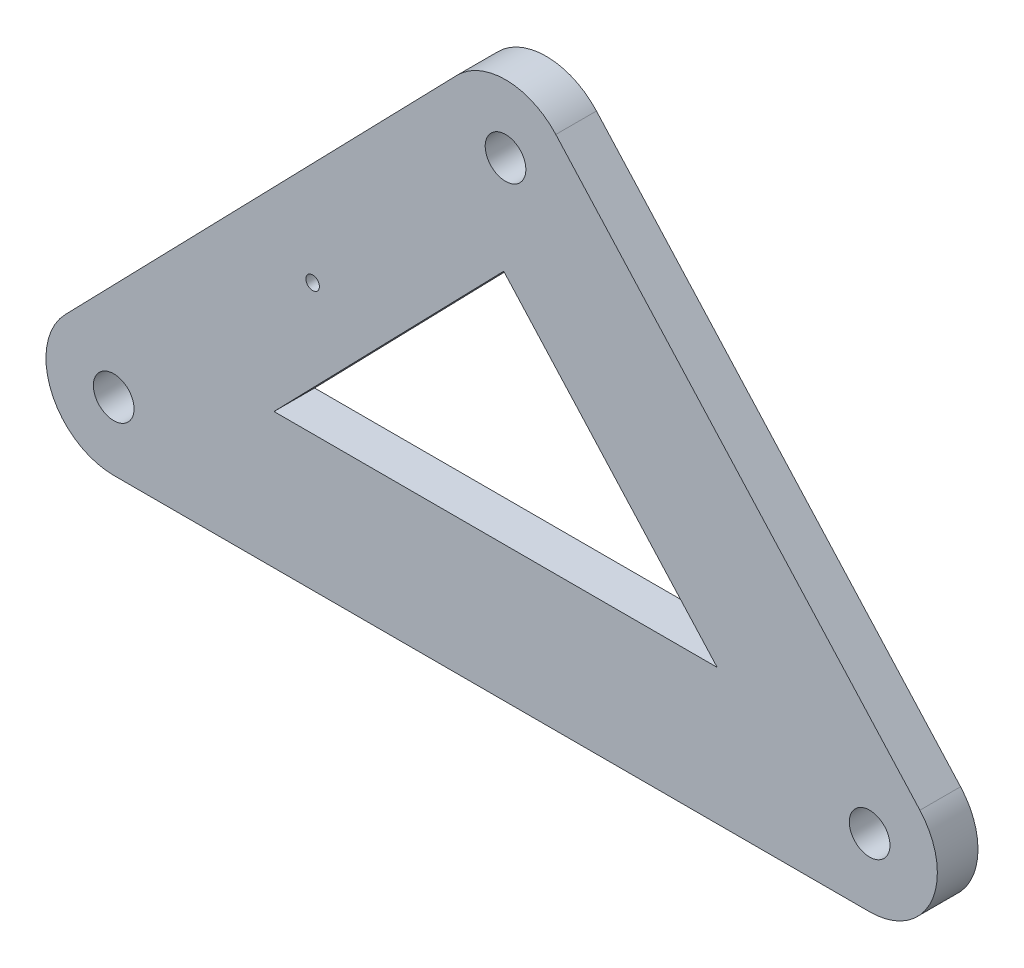
ISO-10303-21;
HEADER;
FILE_DESCRIPTION(('STEP AP214'),'2;1');
FILE_NAME('part.step','',(''),(''),'','','');
FILE_SCHEMA(('AUTOMOTIVE_DESIGN { 1 0 10303 214 1 1 1 1 }'));
ENDSEC;
DATA;
#1=APPLICATION_CONTEXT('core data for automotive mechanical design processes');
#2=APPLICATION_PROTOCOL_DEFINITION('international standard','automotive_design',2000,#1);
#3=PRODUCT_CONTEXT('',#1,'mechanical');
#4=PRODUCT('Part','Part','',(#3));
#5=PRODUCT_RELATED_PRODUCT_CATEGORY('part','',(#4));
#6=PRODUCT_DEFINITION_FORMATION('','',#4);
#7=PRODUCT_DEFINITION_CONTEXT('part definition',#1,'design');
#8=PRODUCT_DEFINITION('design','',#6,#7);
#9=PRODUCT_DEFINITION_SHAPE('','',#8);
#10=(LENGTH_UNIT() NAMED_UNIT(*) SI_UNIT(.MILLI.,.METRE.));
#11=(NAMED_UNIT(*) PLANE_ANGLE_UNIT() SI_UNIT($,.RADIAN.));
#12=(NAMED_UNIT(*) SI_UNIT($,.STERADIAN.) SOLID_ANGLE_UNIT());
#13=UNCERTAINTY_MEASURE_WITH_UNIT(LENGTH_MEASURE(1.E-05),#10,'distance_accuracy_value','');
#14=(GEOMETRIC_REPRESENTATION_CONTEXT(3) GLOBAL_UNCERTAINTY_ASSIGNED_CONTEXT((#13)) GLOBAL_UNIT_ASSIGNED_CONTEXT((#10,
#11,#12)) REPRESENTATION_CONTEXT('',''));
#15=CARTESIAN_POINT('',(0.,0.,0.));
#16=DIRECTION('',(0.,0.,1.));
#17=DIRECTION('',(1.,0.,0.));
#18=AXIS2_PLACEMENT_3D('',#15,#16,#17);
#19=CARTESIAN_POINT('',(28.9236559139785,29.7602440945933,3.));
#20=DIRECTION('',(0.,0.,1.));
#21=DIRECTION('',(1.,0.,0.));
#22=AXIS2_PLACEMENT_3D('',#19,#20,#21);
#23=PLANE('',#22);
#24=CARTESIAN_POINT('',(14.6844041623818,14.6605175350608,3.));
#25=DIRECTION('',(0.,0.,1.));
#26=DIRECTION('',(1.,0.,0.));
#27=AXIS2_PLACEMENT_3D('',#24,#25,#26);
#28=CIRCLE('',#27,0.499999999999999);
#29=CARTESIAN_POINT('',(15.1844041623818,14.6605175350608,3.));
#30=VERTEX_POINT('',#29);
#31=EDGE_CURVE('E252',#30,#30,#28,.T.);
#32=ORIENTED_EDGE('',*,*,#31,.F.);
#33=EDGE_LOOP('',(#32));
#34=FACE_BOUND('',#33,.T.);
#35=CARTESIAN_POINT('',(0.,0.,3.));
#36=DIRECTION('',(0.,0.,1.));
#37=DIRECTION('',(1.,0.,0.));
#38=AXIS2_PLACEMENT_3D('',#35,#36,#37);
#39=CIRCLE('',#38,1.5);
#40=CARTESIAN_POINT('',(1.5,0.,3.));
#41=VERTEX_POINT('',#40);
#42=EDGE_CURVE('E263',#41,#41,#39,.T.);
#43=ORIENTED_EDGE('',*,*,#42,.F.);
#44=EDGE_LOOP('',(#43));
#45=FACE_BOUND('',#44,.T.);
#46=DIRECTION('',(-0.670233019601534,0.742150725550956,0.));
#47=VECTOR('',#46,1.);
#48=CARTESIAN_POINT('',(28.7897592995052,22.4484161376041,3.));
#49=LINE('',#48,#47);
#50=CARTESIAN_POINT('',(44.5473463132331,5.,3.));
#51=VERTEX_POINT('',#50);
#52=CARTESIAN_POINT('',(28.7897592995052,22.4484161376041,3.));
#53=VERTEX_POINT('',#52);
#54=EDGE_CURVE('E116',#51,#53,#49,.T.);
#55=ORIENTED_EDGE('',*,*,#54,.F.);
#56=DIRECTION('',(1.,0.,0.));
#57=VECTOR('',#56,1.);
#58=CARTESIAN_POINT('',(44.5473463132331,5.,3.));
#59=LINE('',#58,#57);
#60=CARTESIAN_POINT('',(11.8318343912328,5.,3.));
#61=VERTEX_POINT('',#60);
#62=EDGE_CURVE('E108',#61,#51,#59,.T.);
#63=ORIENTED_EDGE('',*,*,#62,.F.);
#64=DIRECTION('',(-0.696955564192253,-0.717114315532369,0.));
#65=VECTOR('',#64,1.);
#66=CARTESIAN_POINT('',(11.8318343912328,5.,3.));
#67=LINE('',#66,#65);
#68=EDGE_CURVE('E126',#53,#61,#67,.T.);
#69=ORIENTED_EDGE('',*,*,#68,.F.);
#70=EDGE_LOOP('',(#55,#63,#69));
#71=FACE_BOUND('',#70,.T.);
#72=CARTESIAN_POINT('',(28.9236559139785,29.7602440945933,3.));
#73=DIRECTION('',(0.,0.,1.));
#74=DIRECTION('',(1.,0.,0.));
#75=AXIS2_PLACEMENT_3D('',#72,#73,#74);
#76=CIRCLE('',#75,5.);
#77=CARTESIAN_POINT('',(32.6344095417333,33.111409192601,3.));
#78=VERTEX_POINT('',#77);
#79=CARTESIAN_POINT('',(25.3380843363166,33.2450219155546,3.));
#80=VERTEX_POINT('',#79);
#81=EDGE_CURVE('E138',#78,#80,#76,.T.);
#82=ORIENTED_EDGE('',*,*,#81,.T.);
#83=DIRECTION('',(-0.696955564192253,-0.717114315532369,0.));
#84=VECTOR('',#83,1.);
#85=CARTESIAN_POINT('',(-3.58557157766176,3.48477782096135,3.));
#86=LINE('',#85,#84);
#87=CARTESIAN_POINT('',(-3.58557157766176,3.48477782096135,3.));
#88=VERTEX_POINT('',#87);
#89=EDGE_CURVE('E141',#80,#88,#86,.T.);
#90=ORIENTED_EDGE('',*,*,#89,.T.);
#91=CARTESIAN_POINT('',(0.,0.,3.));
#92=DIRECTION('',(0.,0.,1.));
#93=DIRECTION('',(-1.,0.,0.));
#94=AXIS2_PLACEMENT_3D('',#91,#92,#93);
#95=CIRCLE('',#94,5.);
#96=CARTESIAN_POINT('',(1.196959198424E-13,-5.,3.));
#97=VERTEX_POINT('',#96);
#98=EDGE_CURVE('E144',#88,#97,#95,.T.);
#99=ORIENTED_EDGE('',*,*,#98,.T.);
#100=DIRECTION('',(1.,0.,0.));
#101=VECTOR('',#100,1.);
#102=CARTESIAN_POINT('',(55.7999999999999,-5.,3.));
#103=LINE('',#102,#101);
#104=CARTESIAN_POINT('',(55.7999999999999,-5.,3.));
#105=VERTEX_POINT('',#104);
#106=EDGE_CURVE('E146',#97,#105,#103,.T.);
#107=ORIENTED_EDGE('',*,*,#106,.T.);
#108=CARTESIAN_POINT('',(55.8,0.,3.));
#109=DIRECTION('',(0.,0.,1.));
#110=DIRECTION('',(1.,0.,0.));
#111=AXIS2_PLACEMENT_3D('',#108,#109,#110);
#112=CIRCLE('',#111,5.);
#113=CARTESIAN_POINT('',(59.5107536277547,3.35116509800775,3.));
#114=VERTEX_POINT('',#113);
#115=EDGE_CURVE('E148',#105,#114,#112,.T.);
#116=ORIENTED_EDGE('',*,*,#115,.T.);
#117=DIRECTION('',(-0.670233019601534,0.742150725550956,0.));
#118=VECTOR('',#117,1.);
#119=CARTESIAN_POINT('',(32.6344095417333,33.111409192601,3.));
#120=LINE('',#119,#118);
#121=EDGE_CURVE('E150',#114,#78,#120,.T.);
#122=ORIENTED_EDGE('',*,*,#121,.T.);
#123=EDGE_LOOP('',(#82,#90,#99,#107,#116,#122));
#124=FACE_BOUND('',#123,.T.);
#125=CARTESIAN_POINT('',(28.9236559139785,29.7602440945933,3.));
#126=DIRECTION('',(0.,0.,1.));
#127=DIRECTION('',(1.,0.,0.));
#128=AXIS2_PLACEMENT_3D('',#125,#126,#127);
#129=CIRCLE('',#128,1.5);
#130=CARTESIAN_POINT('',(30.4236559139785,29.7602440945933,3.));
#131=VERTEX_POINT('',#130);
#132=EDGE_CURVE('E132',#131,#131,#129,.T.);
#133=ORIENTED_EDGE('',*,*,#132,.F.);
#134=EDGE_LOOP('',(#133));
#135=FACE_BOUND('',#134,.T.);
#136=CARTESIAN_POINT('',(55.8,0.,3.));
#137=DIRECTION('',(0.,0.,1.));
#138=DIRECTION('',(1.,0.,0.));
#139=AXIS2_PLACEMENT_3D('',#136,#137,#138);
#140=CIRCLE('',#139,1.5);
#141=CARTESIAN_POINT('',(57.3,0.,3.));
#142=VERTEX_POINT('',#141);
#143=EDGE_CURVE('E257',#142,#142,#140,.T.);
#144=ORIENTED_EDGE('',*,*,#143,.F.);
#145=EDGE_LOOP('',(#144));
#146=FACE_BOUND('',#145,.T.);
#147=ADVANCED_FACE('F37',(#34,#45,#71,#124,#135,#146),#23,.T.);
#148=CARTESIAN_POINT('',(28.9236559139785,29.7602440945933,0.));
#149=DIRECTION('',(0.,0.,1.));
#150=DIRECTION('',(1.,0.,0.));
#151=AXIS2_PLACEMENT_3D('',#148,#149,#150);
#152=PLANE('',#151);
#153=CARTESIAN_POINT('',(14.6844041623818,14.6605175350608,0.));
#154=DIRECTION('',(0.,0.,1.));
#155=DIRECTION('',(1.,0.,0.));
#156=AXIS2_PLACEMENT_3D('',#153,#154,#155);
#157=CIRCLE('',#156,0.499999999999999);
#158=CARTESIAN_POINT('',(15.1844041623818,14.6605175350608,0.));
#159=VERTEX_POINT('',#158);
#160=EDGE_CURVE('E250',#159,#159,#157,.T.);
#161=ORIENTED_EDGE('',*,*,#160,.T.);
#162=EDGE_LOOP('',(#161));
#163=FACE_BOUND('',#162,.T.);
#164=CARTESIAN_POINT('',(28.9236559139785,29.7602440945933,0.));
#165=DIRECTION('',(0.,0.,1.));
#166=DIRECTION('',(1.,0.,0.));
#167=AXIS2_PLACEMENT_3D('',#164,#165,#166);
#168=CIRCLE('',#167,5.);
#169=CARTESIAN_POINT('',(32.6344095417333,33.111409192601,0.));
#170=VERTEX_POINT('',#169);
#171=CARTESIAN_POINT('',(25.3380843363166,33.2450219155546,0.));
#172=VERTEX_POINT('',#171);
#173=EDGE_CURVE('E123',#170,#172,#168,.T.);
#174=ORIENTED_EDGE('',*,*,#173,.F.);
#175=DIRECTION('',(-0.670233019601534,0.742150725550956,0.));
#176=VECTOR('',#175,1.);
#177=CARTESIAN_POINT('',(32.6344095417333,33.111409192601,0.));
#178=LINE('',#177,#176);
#179=CARTESIAN_POINT('',(59.5107536277547,3.35116509800775,0.));
#180=VERTEX_POINT('',#179);
#181=EDGE_CURVE('E142',#180,#170,#178,.T.);
#182=ORIENTED_EDGE('',*,*,#181,.F.);
#183=CARTESIAN_POINT('',(55.8,0.,0.));
#184=DIRECTION('',(0.,0.,1.));
#185=DIRECTION('',(1.,0.,0.));
#186=AXIS2_PLACEMENT_3D('',#183,#184,#185);
#187=CIRCLE('',#186,5.);
#188=CARTESIAN_POINT('',(55.7999999999999,-5.,0.));
#189=VERTEX_POINT('',#188);
#190=EDGE_CURVE('E161',#189,#180,#187,.T.);
#191=ORIENTED_EDGE('',*,*,#190,.F.);
#192=DIRECTION('',(1.,0.,0.));
#193=VECTOR('',#192,1.);
#194=CARTESIAN_POINT('',(55.7999999999999,-5.,0.));
#195=LINE('',#194,#193);
#196=CARTESIAN_POINT('',(1.196959198424E-13,-5.,0.));
#197=VERTEX_POINT('',#196);
#198=EDGE_CURVE('E159',#197,#189,#195,.T.);
#199=ORIENTED_EDGE('',*,*,#198,.F.);
#200=CARTESIAN_POINT('',(0.,0.,0.));
#201=DIRECTION('',(0.,0.,1.));
#202=DIRECTION('',(-1.,0.,0.));
#203=AXIS2_PLACEMENT_3D('',#200,#201,#202);
#204=CIRCLE('',#203,5.);
#205=CARTESIAN_POINT('',(-3.58557157766176,3.48477782096135,0.));
#206=VERTEX_POINT('',#205);
#207=EDGE_CURVE('E157',#206,#197,#204,.T.);
#208=ORIENTED_EDGE('',*,*,#207,.F.);
#209=DIRECTION('',(-0.696955564192253,-0.717114315532369,0.));
#210=VECTOR('',#209,1.);
#211=CARTESIAN_POINT('',(-3.58557157766176,3.48477782096135,0.));
#212=LINE('',#211,#210);
#213=EDGE_CURVE('E155',#172,#206,#212,.T.);
#214=ORIENTED_EDGE('',*,*,#213,.F.);
#215=EDGE_LOOP('',(#174,#182,#191,#199,#208,#214));
#216=FACE_BOUND('',#215,.T.);
#217=DIRECTION('',(1.,0.,0.));
#218=VECTOR('',#217,1.);
#219=CARTESIAN_POINT('',(44.5473463132331,5.,0.));
#220=LINE('',#219,#218);
#221=CARTESIAN_POINT('',(11.8318343912328,5.,0.));
#222=VERTEX_POINT('',#221);
#223=CARTESIAN_POINT('',(44.5473463132331,5.,0.));
#224=VERTEX_POINT('',#223);
#225=EDGE_CURVE('E60',#222,#224,#220,.T.);
#226=ORIENTED_EDGE('',*,*,#225,.T.);
#227=DIRECTION('',(-0.670233019601534,0.742150725550956,0.));
#228=VECTOR('',#227,1.);
#229=CARTESIAN_POINT('',(28.7897592995052,22.4484161376041,0.));
#230=LINE('',#229,#228);
#231=CARTESIAN_POINT('',(28.7897592995052,22.4484161376041,0.));
#232=VERTEX_POINT('',#231);
#233=EDGE_CURVE('E122',#224,#232,#230,.T.);
#234=ORIENTED_EDGE('',*,*,#233,.T.);
#235=DIRECTION('',(-0.696955564192253,-0.717114315532369,0.));
#236=VECTOR('',#235,1.);
#237=CARTESIAN_POINT('',(11.8318343912328,5.,0.));
#238=LINE('',#237,#236);
#239=EDGE_CURVE('E117',#232,#222,#238,.T.);
#240=ORIENTED_EDGE('',*,*,#239,.T.);
#241=EDGE_LOOP('',(#226,#234,#240));
#242=FACE_BOUND('',#241,.T.);
#243=CARTESIAN_POINT('',(28.9236559139785,29.7602440945933,0.));
#244=DIRECTION('',(0.,0.,1.));
#245=DIRECTION('',(1.,0.,0.));
#246=AXIS2_PLACEMENT_3D('',#243,#244,#245);
#247=CIRCLE('',#246,1.5);
#248=CARTESIAN_POINT('',(30.4236559139785,29.7602440945933,0.));
#249=VERTEX_POINT('',#248);
#250=EDGE_CURVE('E266',#249,#249,#247,.T.);
#251=ORIENTED_EDGE('',*,*,#250,.T.);
#252=EDGE_LOOP('',(#251));
#253=FACE_BOUND('',#252,.T.);
#254=CARTESIAN_POINT('',(0.,0.,0.));
#255=DIRECTION('',(0.,0.,1.));
#256=DIRECTION('',(1.,0.,0.));
#257=AXIS2_PLACEMENT_3D('',#254,#255,#256);
#258=CIRCLE('',#257,1.5);
#259=CARTESIAN_POINT('',(1.5,0.,0.));
#260=VERTEX_POINT('',#259);
#261=EDGE_CURVE('E260',#260,#260,#258,.T.);
#262=ORIENTED_EDGE('',*,*,#261,.T.);
#263=EDGE_LOOP('',(#262));
#264=FACE_BOUND('',#263,.T.);
#265=CARTESIAN_POINT('',(55.8,0.,0.));
#266=DIRECTION('',(0.,0.,1.));
#267=DIRECTION('',(1.,0.,0.));
#268=AXIS2_PLACEMENT_3D('',#265,#266,#267);
#269=CIRCLE('',#268,1.5);
#270=CARTESIAN_POINT('',(57.3,0.,0.));
#271=VERTEX_POINT('',#270);
#272=EDGE_CURVE('E254',#271,#271,#269,.T.);
#273=ORIENTED_EDGE('',*,*,#272,.T.);
#274=EDGE_LOOP('',(#273));
#275=FACE_BOUND('',#274,.T.);
#276=ADVANCED_FACE('F185',(#163,#216,#242,#253,#264,#275),#152,.F.);
#277=CARTESIAN_POINT('',(28.9236559139785,29.7602440945933,3.));
#278=DIRECTION('',(0.,0.,-1.));
#279=DIRECTION('',(-1.,0.,0.));
#280=AXIS2_PLACEMENT_3D('',#277,#278,#279);
#281=CYLINDRICAL_SURFACE('',#280,5.);
#282=ORIENTED_EDGE('',*,*,#173,.T.);
#283=DIRECTION('',(0.,0.,-1.));
#284=VECTOR('',#283,1.);
#285=CARTESIAN_POINT('',(25.3380843363166,33.2450219155546,3.));
#286=LINE('',#285,#284);
#287=EDGE_CURVE('E11',#80,#172,#286,.T.);
#288=ORIENTED_EDGE('',*,*,#287,.F.);
#289=ORIENTED_EDGE('',*,*,#81,.F.);
#290=DIRECTION('',(0.,0.,-1.));
#291=VECTOR('',#290,1.);
#292=CARTESIAN_POINT('',(32.6344095417333,33.111409192601,3.));
#293=LINE('',#292,#291);
#294=EDGE_CURVE('E152',#78,#170,#293,.T.);
#295=ORIENTED_EDGE('',*,*,#294,.T.);
#296=EDGE_LOOP('',(#282,#288,#289,#295));
#297=FACE_BOUND('',#296,.T.);
#298=ADVANCED_FACE('F39',(#297),#281,.T.);
#299=CARTESIAN_POINT('',(-3.58557157766176,3.48477782096135,3.));
#300=DIRECTION('',(0.717114315532369,-0.696955564192253,0.));
#301=DIRECTION('',(0.696955564192253,0.717114315532369,0.));
#302=AXIS2_PLACEMENT_3D('',#299,#300,#301);
#303=PLANE('',#302);
#304=ORIENTED_EDGE('',*,*,#213,.T.);
#305=DIRECTION('',(0.,0.,-1.));
#306=VECTOR('',#305,1.);
#307=CARTESIAN_POINT('',(-3.58557157766176,3.48477782096135,3.));
#308=LINE('',#307,#306);
#309=EDGE_CURVE('E45',#88,#206,#308,.T.);
#310=ORIENTED_EDGE('',*,*,#309,.F.);
#311=ORIENTED_EDGE('',*,*,#89,.F.);
#312=ORIENTED_EDGE('',*,*,#287,.T.);
#313=EDGE_LOOP('',(#304,#310,#311,#312));
#314=FACE_BOUND('',#313,.T.);
#315=ADVANCED_FACE('F202',(#314),#303,.F.);
#316=CARTESIAN_POINT('',(0.,0.,3.));
#317=DIRECTION('',(0.,0.,-1.));
#318=DIRECTION('',(-1.,0.,0.));
#319=AXIS2_PLACEMENT_3D('',#316,#317,#318);
#320=CYLINDRICAL_SURFACE('',#319,5.);
#321=ORIENTED_EDGE('',*,*,#207,.T.);
#322=DIRECTION('',(0.,0.,-1.));
#323=VECTOR('',#322,1.);
#324=CARTESIAN_POINT('',(1.196959198424E-13,-5.,3.));
#325=LINE('',#324,#323);
#326=EDGE_CURVE('E172',#97,#197,#325,.T.);
#327=ORIENTED_EDGE('',*,*,#326,.F.);
#328=ORIENTED_EDGE('',*,*,#98,.F.);
#329=ORIENTED_EDGE('',*,*,#309,.T.);
#330=EDGE_LOOP('',(#321,#327,#328,#329));
#331=FACE_BOUND('',#330,.T.);
#332=ADVANCED_FACE('F179',(#331),#320,.T.);
#333=CARTESIAN_POINT('',(55.7999999999999,-5.,3.));
#334=DIRECTION('',(0.,1.,0.));
#335=DIRECTION('',(-1.,0.,0.));
#336=AXIS2_PLACEMENT_3D('',#333,#334,#335);
#337=PLANE('',#336);
#338=ORIENTED_EDGE('',*,*,#198,.T.);
#339=DIRECTION('',(0.,0.,-1.));
#340=VECTOR('',#339,1.);
#341=CARTESIAN_POINT('',(55.7999999999999,-5.,3.));
#342=LINE('',#341,#340);
#343=EDGE_CURVE('E169',#105,#189,#342,.T.);
#344=ORIENTED_EDGE('',*,*,#343,.F.);
#345=ORIENTED_EDGE('',*,*,#106,.F.);
#346=ORIENTED_EDGE('',*,*,#326,.T.);
#347=EDGE_LOOP('',(#338,#344,#345,#346));
#348=FACE_BOUND('',#347,.T.);
#349=ADVANCED_FACE('F191',(#348),#337,.F.);
#350=CARTESIAN_POINT('',(55.8,0.,3.));
#351=DIRECTION('',(0.,0.,-1.));
#352=DIRECTION('',(-1.,0.,0.));
#353=AXIS2_PLACEMENT_3D('',#350,#351,#352);
#354=CYLINDRICAL_SURFACE('',#353,5.);
#355=ORIENTED_EDGE('',*,*,#190,.T.);
#356=DIRECTION('',(0.,0.,-1.));
#357=VECTOR('',#356,1.);
#358=CARTESIAN_POINT('',(59.5107536277547,3.35116509800775,3.));
#359=LINE('',#358,#357);
#360=EDGE_CURVE('E166',#114,#180,#359,.T.);
#361=ORIENTED_EDGE('',*,*,#360,.F.);
#362=ORIENTED_EDGE('',*,*,#115,.F.);
#363=ORIENTED_EDGE('',*,*,#343,.T.);
#364=EDGE_LOOP('',(#355,#361,#362,#363));
#365=FACE_BOUND('',#364,.T.);
#366=ADVANCED_FACE('F195',(#365),#354,.T.);
#367=CARTESIAN_POINT('',(32.6344095417333,33.111409192601,3.));
#368=DIRECTION('',(-0.742150725550956,-0.670233019601534,0.));
#369=DIRECTION('',(0.670233019601534,-0.742150725550956,0.));
#370=AXIS2_PLACEMENT_3D('',#367,#368,#369);
#371=PLANE('',#370);
#372=ORIENTED_EDGE('',*,*,#181,.T.);
#373=ORIENTED_EDGE('',*,*,#294,.F.);
#374=ORIENTED_EDGE('',*,*,#121,.F.);
#375=ORIENTED_EDGE('',*,*,#360,.T.);
#376=EDGE_LOOP('',(#372,#373,#374,#375));
#377=FACE_BOUND('',#376,.T.);
#378=ADVANCED_FACE('F205',(#377),#371,.F.);
#379=CARTESIAN_POINT('',(44.5473463132331,5.,3.));
#380=DIRECTION('',(0.,1.,0.));
#381=DIRECTION('',(-1.,0.,0.));
#382=AXIS2_PLACEMENT_3D('',#379,#380,#381);
#383=PLANE('',#382);
#384=ORIENTED_EDGE('',*,*,#225,.F.);
#385=DIRECTION('',(0.,0.,-1.));
#386=VECTOR('',#385,1.);
#387=CARTESIAN_POINT('',(11.8318343912328,5.,3.));
#388=LINE('',#387,#386);
#389=EDGE_CURVE('E112',#61,#222,#388,.T.);
#390=ORIENTED_EDGE('',*,*,#389,.F.);
#391=ORIENTED_EDGE('',*,*,#62,.T.);
#392=DIRECTION('',(0.,0.,-1.));
#393=VECTOR('',#392,1.);
#394=CARTESIAN_POINT('',(44.5473463132331,5.,3.));
#395=LINE('',#394,#393);
#396=EDGE_CURVE('E111',#51,#224,#395,.T.);
#397=ORIENTED_EDGE('',*,*,#396,.T.);
#398=EDGE_LOOP('',(#384,#390,#391,#397));
#399=FACE_BOUND('',#398,.T.);
#400=ADVANCED_FACE('F110',(#399),#383,.T.);
#401=CARTESIAN_POINT('',(28.7897592995052,22.4484161376041,3.));
#402=DIRECTION('',(-0.742150725550956,-0.670233019601534,0.));
#403=DIRECTION('',(0.670233019601534,-0.742150725550956,0.));
#404=AXIS2_PLACEMENT_3D('',#401,#402,#403);
#405=PLANE('',#404);
#406=ORIENTED_EDGE('',*,*,#233,.F.);
#407=ORIENTED_EDGE('',*,*,#396,.F.);
#408=ORIENTED_EDGE('',*,*,#54,.T.);
#409=DIRECTION('',(0.,0.,-1.));
#410=VECTOR('',#409,1.);
#411=CARTESIAN_POINT('',(28.7897592995052,22.4484161376041,3.));
#412=LINE('',#411,#410);
#413=EDGE_CURVE('E52',#53,#232,#412,.T.);
#414=ORIENTED_EDGE('',*,*,#413,.T.);
#415=EDGE_LOOP('',(#406,#407,#408,#414));
#416=FACE_BOUND('',#415,.T.);
#417=ADVANCED_FACE('F120',(#416),#405,.T.);
#418=CARTESIAN_POINT('',(11.8318343912328,5.,3.));
#419=DIRECTION('',(0.717114315532369,-0.696955564192253,0.));
#420=DIRECTION('',(0.696955564192253,0.717114315532369,0.));
#421=AXIS2_PLACEMENT_3D('',#418,#419,#420);
#422=PLANE('',#421);
#423=ORIENTED_EDGE('',*,*,#239,.F.);
#424=ORIENTED_EDGE('',*,*,#413,.F.);
#425=ORIENTED_EDGE('',*,*,#68,.T.);
#426=ORIENTED_EDGE('',*,*,#389,.T.);
#427=EDGE_LOOP('',(#423,#424,#425,#426));
#428=FACE_BOUND('',#427,.T.);
#429=ADVANCED_FACE('F227',(#428),#422,.T.);
#430=CARTESIAN_POINT('',(28.9236559139785,29.7602440945933,3.));
#431=DIRECTION('',(0.,0.,-1.));
#432=DIRECTION('',(-1.,0.,0.));
#433=AXIS2_PLACEMENT_3D('',#430,#431,#432);
#434=CYLINDRICAL_SURFACE('',#433,1.5);
#435=ORIENTED_EDGE('',*,*,#132,.T.);
#436=EDGE_LOOP('',(#435));
#437=FACE_BOUND('',#436,.T.);
#438=ORIENTED_EDGE('',*,*,#250,.F.);
#439=EDGE_LOOP('',(#438));
#440=FACE_BOUND('',#439,.T.);
#441=ADVANCED_FACE('F230',(#437,#440),#434,.F.);
#442=CARTESIAN_POINT('',(0.,0.,3.));
#443=DIRECTION('',(0.,0.,-1.));
#444=DIRECTION('',(-1.,0.,0.));
#445=AXIS2_PLACEMENT_3D('',#442,#443,#444);
#446=CYLINDRICAL_SURFACE('',#445,1.5);
#447=ORIENTED_EDGE('',*,*,#42,.T.);
#448=EDGE_LOOP('',(#447));
#449=FACE_BOUND('',#448,.T.);
#450=ORIENTED_EDGE('',*,*,#261,.F.);
#451=EDGE_LOOP('',(#450));
#452=FACE_BOUND('',#451,.T.);
#453=ADVANCED_FACE('F233',(#449,#452),#446,.F.);
#454=CARTESIAN_POINT('',(55.8,0.,3.));
#455=DIRECTION('',(0.,0.,-1.));
#456=DIRECTION('',(-1.,0.,0.));
#457=AXIS2_PLACEMENT_3D('',#454,#455,#456);
#458=CYLINDRICAL_SURFACE('',#457,1.5);
#459=ORIENTED_EDGE('',*,*,#143,.T.);
#460=EDGE_LOOP('',(#459));
#461=FACE_BOUND('',#460,.T.);
#462=ORIENTED_EDGE('',*,*,#272,.F.);
#463=EDGE_LOOP('',(#462));
#464=FACE_BOUND('',#463,.T.);
#465=ADVANCED_FACE('F237',(#461,#464),#458,.F.);
#466=CARTESIAN_POINT('',(14.6844041623818,14.6605175350608,0.));
#467=DIRECTION('',(0.,0.,1.));
#468=DIRECTION('',(1.,0.,0.));
#469=AXIS2_PLACEMENT_3D('',#466,#467,#468);
#470=CYLINDRICAL_SURFACE('',#469,0.499999999999999);
#471=ORIENTED_EDGE('',*,*,#160,.F.);
#472=EDGE_LOOP('',(#471));
#473=FACE_BOUND('',#472,.T.);
#474=ORIENTED_EDGE('',*,*,#31,.T.);
#475=EDGE_LOOP('',(#474));
#476=FACE_BOUND('',#475,.T.);
#477=ADVANCED_FACE('F241',(#473,#476),#470,.F.);
#478=CLOSED_SHELL('',(#147,#276,#298,#315,#332,#349,#366,#378,#400,#417,#429,#441,#453,#465,#477));
#479=MANIFOLD_SOLID_BREP('B2',#478);
#480=ADVANCED_BREP_SHAPE_REPRESENTATION('',(#18,#479),#14);
#481=SHAPE_DEFINITION_REPRESENTATION(#9,#480);
ENDSEC;
END-ISO-10303-21;
